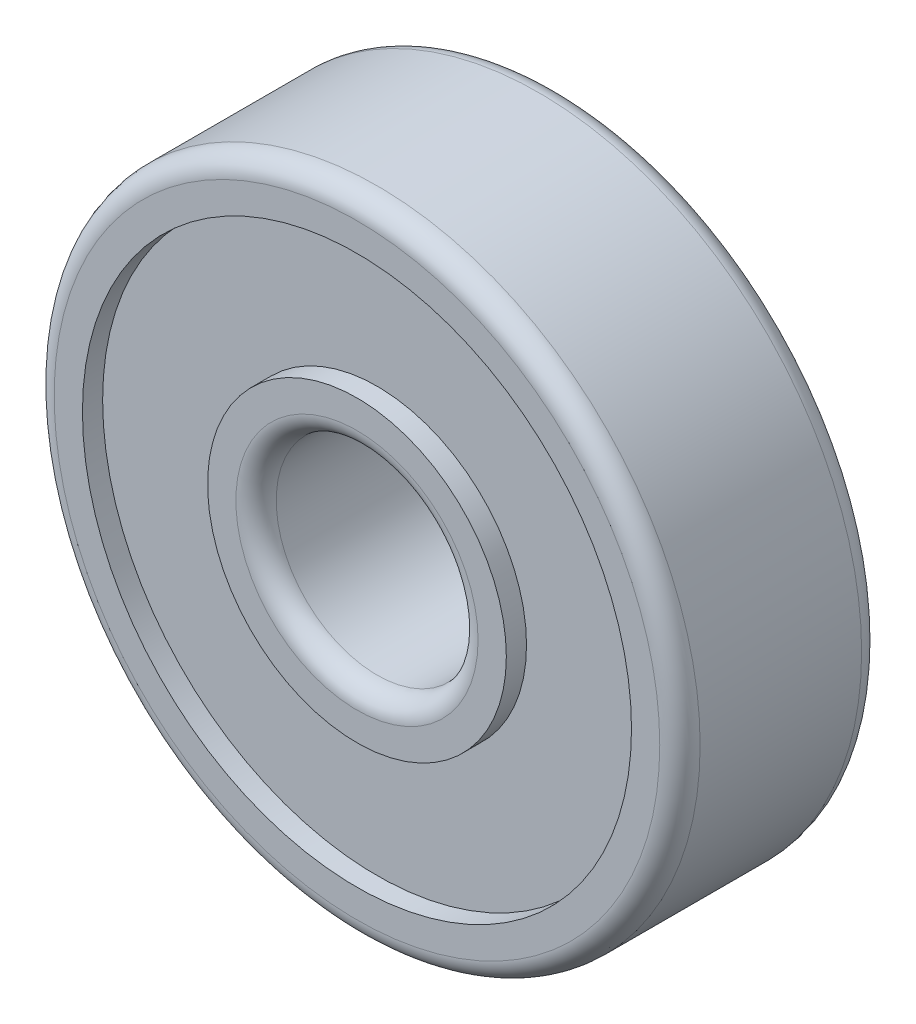
ISO-10303-21;
HEADER;
FILE_DESCRIPTION(('STEP AP214'),'2;1');
FILE_NAME('part.step','',(''),(''),'','','');
FILE_SCHEMA(('AUTOMOTIVE_DESIGN { 1 0 10303 214 1 1 1 1 }'));
ENDSEC;
DATA;
#1=APPLICATION_CONTEXT('core data for automotive mechanical design processes');
#2=APPLICATION_PROTOCOL_DEFINITION('international standard','automotive_design',2000,#1);
#3=PRODUCT_CONTEXT('',#1,'mechanical');
#4=PRODUCT('Part','Part','',(#3));
#5=PRODUCT_RELATED_PRODUCT_CATEGORY('part','',(#4));
#6=PRODUCT_DEFINITION_FORMATION('','',#4);
#7=PRODUCT_DEFINITION_CONTEXT('part definition',#1,'design');
#8=PRODUCT_DEFINITION('design','',#6,#7);
#9=PRODUCT_DEFINITION_SHAPE('','',#8);
#10=(LENGTH_UNIT() NAMED_UNIT(*) SI_UNIT(.MILLI.,.METRE.));
#11=(NAMED_UNIT(*) PLANE_ANGLE_UNIT() SI_UNIT($,.RADIAN.));
#12=(NAMED_UNIT(*) SI_UNIT($,.STERADIAN.) SOLID_ANGLE_UNIT());
#13=UNCERTAINTY_MEASURE_WITH_UNIT(LENGTH_MEASURE(1.E-05),#10,'distance_accuracy_value','');
#14=(GEOMETRIC_REPRESENTATION_CONTEXT(3) GLOBAL_UNCERTAINTY_ASSIGNED_CONTEXT((#13)) GLOBAL_UNIT_ASSIGNED_CONTEXT((#10,
#11,#12)) REPRESENTATION_CONTEXT('',''));
#15=CARTESIAN_POINT('',(0.,0.,0.));
#16=DIRECTION('',(0.,0.,1.));
#17=DIRECTION('',(1.,0.,0.));
#18=AXIS2_PLACEMENT_3D('',#15,#16,#17);
#19=CARTESIAN_POINT('',(0.,0.,0.));
#20=DIRECTION('',(0.,0.,1.));
#21=DIRECTION('',(1.,0.,0.));
#22=AXIS2_PLACEMENT_3D('',#19,#20,#21);
#23=PLANE('',#22);
#24=CARTESIAN_POINT('',(0.,0.,0.));
#25=DIRECTION('',(0.,0.,1.));
#26=DIRECTION('',(1.,0.,0.));
#27=AXIS2_PLACEMENT_3D('',#24,#25,#26);
#28=CIRCLE('',#27,3.);
#29=CARTESIAN_POINT('',(3.,0.,0.));
#30=VERTEX_POINT('',#29);
#31=EDGE_CURVE('E72',#30,#30,#28,.T.);
#32=ORIENTED_EDGE('',*,*,#31,.T.);
#33=EDGE_LOOP('',(#32));
#34=FACE_BOUND('',#33,.T.);
#35=CARTESIAN_POINT('',(0.,0.,0.));
#36=DIRECTION('',(0.,0.,-1.));
#37=DIRECTION('',(-1.,0.,0.));
#38=AXIS2_PLACEMENT_3D('',#35,#36,#37);
#39=CIRCLE('',#38,3.7);
#40=CARTESIAN_POINT('',(-3.7,0.,0.));
#41=VERTEX_POINT('',#40);
#42=EDGE_CURVE('E94',#41,#41,#39,.T.);
#43=ORIENTED_EDGE('',*,*,#42,.T.);
#44=EDGE_LOOP('',(#43));
#45=FACE_BOUND('',#44,.T.);
#46=ADVANCED_FACE('F43',(#34,#45),#23,.F.);
#47=CARTESIAN_POINT('',(0.,0.,5.));
#48=DIRECTION('',(0.,0.,1.));
#49=DIRECTION('',(1.,0.,0.));
#50=AXIS2_PLACEMENT_3D('',#47,#48,#49);
#51=PLANE('',#50);
#52=CARTESIAN_POINT('',(0.,0.,5.));
#53=DIRECTION('',(0.,0.,1.));
#54=DIRECTION('',(1.,0.,0.));
#55=AXIS2_PLACEMENT_3D('',#52,#53,#54);
#56=CIRCLE('',#55,3.);
#57=CARTESIAN_POINT('',(3.,0.,5.));
#58=VERTEX_POINT('',#57);
#59=EDGE_CURVE('E63',#58,#58,#56,.F.);
#60=ORIENTED_EDGE('',*,*,#59,.T.);
#61=EDGE_LOOP('',(#60));
#62=FACE_BOUND('',#61,.T.);
#63=CARTESIAN_POINT('',(0.,0.,5.));
#64=DIRECTION('',(0.,0.,1.));
#65=DIRECTION('',(1.,0.,0.));
#66=AXIS2_PLACEMENT_3D('',#63,#64,#65);
#67=CIRCLE('',#66,3.7);
#68=CARTESIAN_POINT('',(3.7,0.,5.));
#69=VERTEX_POINT('',#68);
#70=EDGE_CURVE('E82',#69,#69,#67,.T.);
#71=ORIENTED_EDGE('',*,*,#70,.T.);
#72=EDGE_LOOP('',(#71));
#73=FACE_BOUND('',#72,.T.);
#74=ADVANCED_FACE('F128',(#62,#73),#51,.T.);
#75=CARTESIAN_POINT('',(0.,0.,5.));
#76=DIRECTION('',(0.,0.,1.));
#77=DIRECTION('',(1.,0.,0.));
#78=AXIS2_PLACEMENT_3D('',#75,#76,#77);
#79=CIRCLE('',#78,7.5);
#80=CARTESIAN_POINT('',(7.5,0.,5.));
#81=VERTEX_POINT('',#80);
#82=EDGE_CURVE('E10',#81,#81,#79,.T.);
#83=ORIENTED_EDGE('',*,*,#82,.T.);
#84=EDGE_LOOP('',(#83));
#85=FACE_BOUND('',#84,.T.);
#86=CARTESIAN_POINT('',(0.,0.,5.));
#87=DIRECTION('',(0.,0.,1.));
#88=DIRECTION('',(1.,0.,0.));
#89=AXIS2_PLACEMENT_3D('',#86,#87,#88);
#90=CIRCLE('',#89,6.8);
#91=CARTESIAN_POINT('',(6.8,0.,5.));
#92=VERTEX_POINT('',#91);
#93=EDGE_CURVE('E76',#92,#92,#90,.T.);
#94=ORIENTED_EDGE('',*,*,#93,.F.);
#95=EDGE_LOOP('',(#94));
#96=FACE_BOUND('',#95,.T.);
#97=ADVANCED_FACE('F119',(#85,#96),#51,.T.);
#98=CARTESIAN_POINT('',(0.,0.,0.));
#99=DIRECTION('',(0.,0.,1.));
#100=DIRECTION('',(1.,0.,0.));
#101=AXIS2_PLACEMENT_3D('',#98,#99,#100);
#102=CIRCLE('',#101,7.5);
#103=CARTESIAN_POINT('',(7.5,0.,0.));
#104=VERTEX_POINT('',#103);
#105=EDGE_CURVE('E50',#104,#104,#102,.F.);
#106=ORIENTED_EDGE('',*,*,#105,.T.);
#107=EDGE_LOOP('',(#106));
#108=FACE_BOUND('',#107,.T.);
#109=CARTESIAN_POINT('',(0.,0.,0.));
#110=DIRECTION('',(0.,0.,-1.));
#111=DIRECTION('',(-1.,0.,0.));
#112=AXIS2_PLACEMENT_3D('',#109,#110,#111);
#113=CIRCLE('',#112,6.8);
#114=CARTESIAN_POINT('',(-6.8,0.,0.));
#115=VERTEX_POINT('',#114);
#116=EDGE_CURVE('E88',#115,#115,#113,.T.);
#117=ORIENTED_EDGE('',*,*,#116,.F.);
#118=EDGE_LOOP('',(#117));
#119=FACE_BOUND('',#118,.T.);
#120=ADVANCED_FACE('F116',(#108,#119),#23,.F.);
#121=CARTESIAN_POINT('',(0.,0.,5.));
#122=DIRECTION('',(0.,0.,-1.));
#123=DIRECTION('',(-1.,0.,0.));
#124=AXIS2_PLACEMENT_3D('',#121,#122,#123);
#125=CYLINDRICAL_SURFACE('',#124,8.);
#126=CARTESIAN_POINT('',(0.,0.,0.5));
#127=DIRECTION('',(0.,0.,1.));
#128=DIRECTION('',(1.,0.,0.));
#129=AXIS2_PLACEMENT_3D('',#126,#127,#128);
#130=CIRCLE('',#129,8.);
#131=CARTESIAN_POINT('',(8.,0.,0.5));
#132=VERTEX_POINT('',#131);
#133=EDGE_CURVE('E54',#132,#132,#130,.T.);
#134=ORIENTED_EDGE('',*,*,#133,.T.);
#135=EDGE_LOOP('',(#134));
#136=FACE_BOUND('',#135,.T.);
#137=CARTESIAN_POINT('',(0.,0.,4.5));
#138=DIRECTION('',(0.,0.,1.));
#139=DIRECTION('',(1.,0.,0.));
#140=AXIS2_PLACEMENT_3D('',#137,#138,#139);
#141=CIRCLE('',#140,8.);
#142=CARTESIAN_POINT('',(8.,0.,4.5));
#143=VERTEX_POINT('',#142);
#144=EDGE_CURVE('E58',#143,#143,#141,.F.);
#145=ORIENTED_EDGE('',*,*,#144,.T.);
#146=EDGE_LOOP('',(#145));
#147=FACE_BOUND('',#146,.T.);
#148=ADVANCED_FACE('F118',(#136,#147),#125,.T.);
#149=CARTESIAN_POINT('',(0.,0.,5.));
#150=DIRECTION('',(0.,0.,-1.));
#151=DIRECTION('',(-1.,0.,0.));
#152=AXIS2_PLACEMENT_3D('',#149,#150,#151);
#153=CYLINDRICAL_SURFACE('',#152,2.5);
#154=CARTESIAN_POINT('',(0.,0.,0.5));
#155=DIRECTION('',(0.,0.,1.));
#156=DIRECTION('',(1.,0.,0.));
#157=AXIS2_PLACEMENT_3D('',#154,#155,#156);
#158=CIRCLE('',#157,2.5);
#159=CARTESIAN_POINT('',(2.5,0.,0.5));
#160=VERTEX_POINT('',#159);
#161=EDGE_CURVE('E66',#160,#160,#158,.F.);
#162=ORIENTED_EDGE('',*,*,#161,.T.);
#163=EDGE_LOOP('',(#162));
#164=FACE_BOUND('',#163,.T.);
#165=CARTESIAN_POINT('',(0.,0.,4.5));
#166=DIRECTION('',(0.,0.,1.));
#167=DIRECTION('',(1.,0.,0.));
#168=AXIS2_PLACEMENT_3D('',#165,#166,#167);
#169=CIRCLE('',#168,2.5);
#170=CARTESIAN_POINT('',(2.5,0.,4.5));
#171=VERTEX_POINT('',#170);
#172=EDGE_CURVE('E69',#171,#171,#169,.T.);
#173=ORIENTED_EDGE('',*,*,#172,.T.);
#174=EDGE_LOOP('',(#173));
#175=FACE_BOUND('',#174,.T.);
#176=ADVANCED_FACE('F125',(#164,#175),#153,.F.);
#177=CARTESIAN_POINT('',(0.,0.,4.5));
#178=DIRECTION('',(0.,0.,1.));
#179=DIRECTION('',(1.,0.,0.));
#180=AXIS2_PLACEMENT_3D('',#177,#178,#179);
#181=CYLINDRICAL_SURFACE('',#180,6.8);
#182=CARTESIAN_POINT('',(0.,0.,4.5));
#183=DIRECTION('',(0.,0.,1.));
#184=DIRECTION('',(1.,0.,0.));
#185=AXIS2_PLACEMENT_3D('',#182,#183,#184);
#186=CIRCLE('',#185,6.8);
#187=CARTESIAN_POINT('',(6.8,0.,4.5));
#188=VERTEX_POINT('',#187);
#189=EDGE_CURVE('E75',#188,#188,#186,.T.);
#190=ORIENTED_EDGE('',*,*,#189,.F.);
#191=EDGE_LOOP('',(#190));
#192=FACE_BOUND('',#191,.T.);
#193=ORIENTED_EDGE('',*,*,#93,.T.);
#194=EDGE_LOOP('',(#193));
#195=FACE_BOUND('',#194,.T.);
#196=ADVANCED_FACE('F155',(#192,#195),#181,.F.);
#197=CARTESIAN_POINT('',(0.,0.,4.5));
#198=DIRECTION('',(0.,0.,1.));
#199=DIRECTION('',(1.,0.,0.));
#200=AXIS2_PLACEMENT_3D('',#197,#198,#199);
#201=PLANE('',#200);
#202=CARTESIAN_POINT('',(0.,0.,4.5));
#203=DIRECTION('',(0.,0.,1.));
#204=DIRECTION('',(1.,0.,0.));
#205=AXIS2_PLACEMENT_3D('',#202,#203,#204);
#206=CIRCLE('',#205,3.7);
#207=CARTESIAN_POINT('',(3.7,0.,4.5));
#208=VERTEX_POINT('',#207);
#209=EDGE_CURVE('E79',#208,#208,#206,.T.);
#210=ORIENTED_EDGE('',*,*,#209,.F.);
#211=EDGE_LOOP('',(#210));
#212=FACE_BOUND('',#211,.T.);
#213=ORIENTED_EDGE('',*,*,#189,.T.);
#214=EDGE_LOOP('',(#213));
#215=FACE_BOUND('',#214,.T.);
#216=ADVANCED_FACE('F151',(#212,#215),#201,.T.);
#217=CARTESIAN_POINT('',(0.,0.,4.5));
#218=DIRECTION('',(0.,0.,1.));
#219=DIRECTION('',(1.,0.,0.));
#220=AXIS2_PLACEMENT_3D('',#217,#218,#219);
#221=CYLINDRICAL_SURFACE('',#220,3.7);
#222=ORIENTED_EDGE('',*,*,#209,.T.);
#223=EDGE_LOOP('',(#222));
#224=FACE_BOUND('',#223,.T.);
#225=ORIENTED_EDGE('',*,*,#70,.F.);
#226=EDGE_LOOP('',(#225));
#227=FACE_BOUND('',#226,.T.);
#228=ADVANCED_FACE('F112',(#224,#227),#221,.T.);
#229=CARTESIAN_POINT('',(0.,0.,0.5));
#230=DIRECTION('',(0.,0.,-1.));
#231=DIRECTION('',(-1.,0.,0.));
#232=AXIS2_PLACEMENT_3D('',#229,#230,#231);
#233=CYLINDRICAL_SURFACE('',#232,6.8);
#234=CARTESIAN_POINT('',(0.,0.,0.5));
#235=DIRECTION('',(0.,0.,-1.));
#236=DIRECTION('',(-1.,0.,0.));
#237=AXIS2_PLACEMENT_3D('',#234,#235,#236);
#238=CIRCLE('',#237,6.8);
#239=CARTESIAN_POINT('',(-6.8,0.,0.5));
#240=VERTEX_POINT('',#239);
#241=EDGE_CURVE('E85',#240,#240,#238,.T.);
#242=ORIENTED_EDGE('',*,*,#241,.F.);
#243=EDGE_LOOP('',(#242));
#244=FACE_BOUND('',#243,.T.);
#245=ORIENTED_EDGE('',*,*,#116,.T.);
#246=EDGE_LOOP('',(#245));
#247=FACE_BOUND('',#246,.T.);
#248=ADVANCED_FACE('F106',(#244,#247),#233,.F.);
#249=CARTESIAN_POINT('',(0.,0.,0.5));
#250=DIRECTION('',(0.,0.,-1.));
#251=DIRECTION('',(-1.,0.,0.));
#252=AXIS2_PLACEMENT_3D('',#249,#250,#251);
#253=PLANE('',#252);
#254=CARTESIAN_POINT('',(0.,0.,0.5));
#255=DIRECTION('',(0.,0.,-1.));
#256=DIRECTION('',(-1.,0.,0.));
#257=AXIS2_PLACEMENT_3D('',#254,#255,#256);
#258=CIRCLE('',#257,3.7);
#259=CARTESIAN_POINT('',(-3.7,0.,0.5));
#260=VERTEX_POINT('',#259);
#261=EDGE_CURVE('E91',#260,#260,#258,.T.);
#262=ORIENTED_EDGE('',*,*,#261,.F.);
#263=EDGE_LOOP('',(#262));
#264=FACE_BOUND('',#263,.T.);
#265=ORIENTED_EDGE('',*,*,#241,.T.);
#266=EDGE_LOOP('',(#265));
#267=FACE_BOUND('',#266,.T.);
#268=ADVANCED_FACE('F103',(#264,#267),#253,.T.);
#269=CARTESIAN_POINT('',(0.,0.,0.5));
#270=DIRECTION('',(0.,0.,-1.));
#271=DIRECTION('',(-1.,0.,0.));
#272=AXIS2_PLACEMENT_3D('',#269,#270,#271);
#273=CYLINDRICAL_SURFACE('',#272,3.7);
#274=ORIENTED_EDGE('',*,*,#261,.T.);
#275=EDGE_LOOP('',(#274));
#276=FACE_BOUND('',#275,.T.);
#277=ORIENTED_EDGE('',*,*,#42,.F.);
#278=EDGE_LOOP('',(#277));
#279=FACE_BOUND('',#278,.T.);
#280=ADVANCED_FACE('F100',(#276,#279),#273,.T.);
#281=CARTESIAN_POINT('',(0.,0.,0.5));
#282=DIRECTION('',(0.,0.,1.));
#283=DIRECTION('',(1.,0.,0.));
#284=AXIS2_PLACEMENT_3D('',#281,#282,#283);
#285=TOROIDAL_SURFACE('',#284,3.,0.5);
#286=ORIENTED_EDGE('',*,*,#161,.F.);
#287=EDGE_LOOP('',(#286));
#288=FACE_BOUND('',#287,.T.);
#289=ORIENTED_EDGE('',*,*,#31,.F.);
#290=EDGE_LOOP('',(#289));
#291=FACE_BOUND('',#290,.T.);
#292=ADVANCED_FACE('F140',(#288,#291),#285,.T.);
#293=CARTESIAN_POINT('',(0.,0.,4.5));
#294=DIRECTION('',(0.,0.,1.));
#295=DIRECTION('',(1.,0.,0.));
#296=AXIS2_PLACEMENT_3D('',#293,#294,#295);
#297=TOROIDAL_SURFACE('',#296,3.,0.5);
#298=ORIENTED_EDGE('',*,*,#59,.F.);
#299=EDGE_LOOP('',(#298));
#300=FACE_BOUND('',#299,.T.);
#301=ORIENTED_EDGE('',*,*,#172,.F.);
#302=EDGE_LOOP('',(#301));
#303=FACE_BOUND('',#302,.T.);
#304=ADVANCED_FACE('F145',(#300,#303),#297,.T.);
#305=CARTESIAN_POINT('',(0.,0.,0.5));
#306=DIRECTION('',(0.,0.,1.));
#307=DIRECTION('',(1.,0.,0.));
#308=AXIS2_PLACEMENT_3D('',#305,#306,#307);
#309=TOROIDAL_SURFACE('',#308,7.5,0.5);
#310=ORIENTED_EDGE('',*,*,#105,.F.);
#311=EDGE_LOOP('',(#310));
#312=FACE_BOUND('',#311,.T.);
#313=ORIENTED_EDGE('',*,*,#133,.F.);
#314=EDGE_LOOP('',(#313));
#315=FACE_BOUND('',#314,.T.);
#316=ADVANCED_FACE('F169',(#312,#315),#309,.T.);
#317=CARTESIAN_POINT('',(0.,0.,4.5));
#318=DIRECTION('',(0.,0.,1.));
#319=DIRECTION('',(1.,0.,0.));
#320=AXIS2_PLACEMENT_3D('',#317,#318,#319);
#321=TOROIDAL_SURFACE('',#320,7.5,0.5);
#322=ORIENTED_EDGE('',*,*,#144,.F.);
#323=EDGE_LOOP('',(#322));
#324=FACE_BOUND('',#323,.T.);
#325=ORIENTED_EDGE('',*,*,#82,.F.);
#326=EDGE_LOOP('',(#325));
#327=FACE_BOUND('',#326,.T.);
#328=ADVANCED_FACE('F45',(#324,#327),#321,.T.);
#329=CLOSED_SHELL('',(#46,#74,#97,#120,#148,#176,#196,#216,#228,#248,#268,#280,#292,#304,#316,#328));
#330=MANIFOLD_SOLID_BREP('B2',#329);
#331=ADVANCED_BREP_SHAPE_REPRESENTATION('',(#18,#330),#14);
#332=SHAPE_DEFINITION_REPRESENTATION(#9,#331);
ENDSEC;
END-ISO-10303-21;
